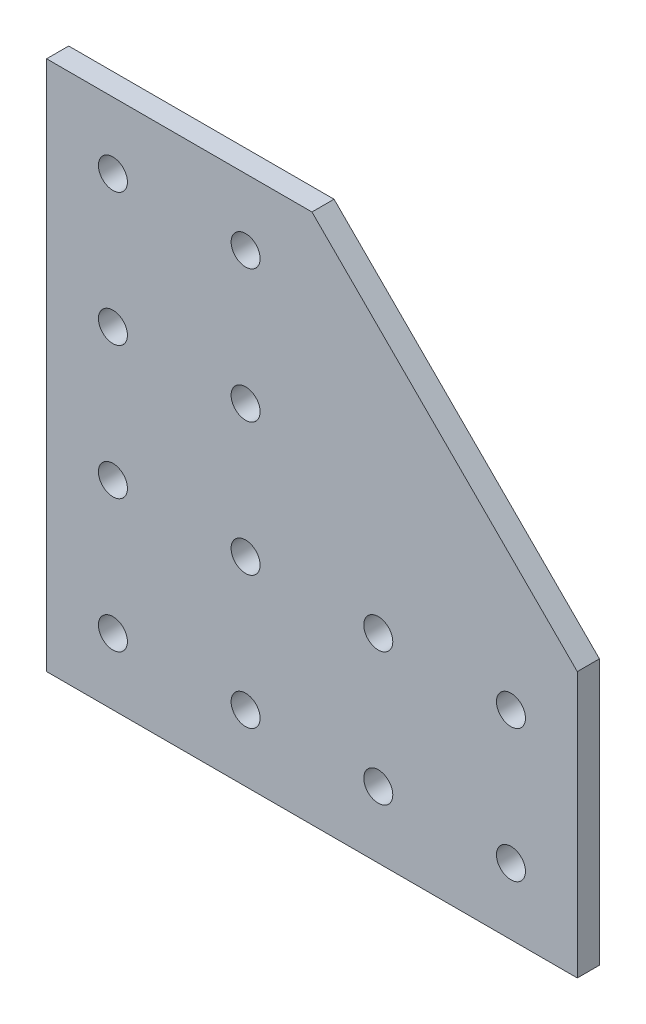
ISO-10303-21;
HEADER;
FILE_DESCRIPTION(('STEP AP214'),'2;1');
FILE_NAME('part.step','',(''),(''),'','','');
FILE_SCHEMA(('AUTOMOTIVE_DESIGN { 1 0 10303 214 1 1 1 1 }'));
ENDSEC;
DATA;
#1=APPLICATION_CONTEXT('core data for automotive mechanical design processes');
#2=APPLICATION_PROTOCOL_DEFINITION('international standard','automotive_design',2000,#1);
#3=PRODUCT_CONTEXT('',#1,'mechanical');
#4=PRODUCT('Part','Part','',(#3));
#5=PRODUCT_RELATED_PRODUCT_CATEGORY('part','',(#4));
#6=PRODUCT_DEFINITION_FORMATION('','',#4);
#7=PRODUCT_DEFINITION_CONTEXT('part definition',#1,'design');
#8=PRODUCT_DEFINITION('design','',#6,#7);
#9=PRODUCT_DEFINITION_SHAPE('','',#8);
#10=(LENGTH_UNIT() NAMED_UNIT(*) SI_UNIT(.MILLI.,.METRE.));
#11=(NAMED_UNIT(*) PLANE_ANGLE_UNIT() SI_UNIT($,.RADIAN.));
#12=(NAMED_UNIT(*) SI_UNIT($,.STERADIAN.) SOLID_ANGLE_UNIT());
#13=UNCERTAINTY_MEASURE_WITH_UNIT(LENGTH_MEASURE(1.E-05),#10,'distance_accuracy_value','');
#14=(GEOMETRIC_REPRESENTATION_CONTEXT(3) GLOBAL_UNCERTAINTY_ASSIGNED_CONTEXT((#13)) GLOBAL_UNIT_ASSIGNED_CONTEXT((#10,
#11,#12)) REPRESENTATION_CONTEXT('',''));
#15=CARTESIAN_POINT('',(0.,0.,0.));
#16=DIRECTION('',(0.,0.,1.));
#17=DIRECTION('',(1.,0.,0.));
#18=AXIS2_PLACEMENT_3D('',#15,#16,#17);
#19=CARTESIAN_POINT('',(0.,0.,3.175));
#20=DIRECTION('',(0.,0.,-1.));
#21=DIRECTION('',(-1.,0.,0.));
#22=AXIS2_PLACEMENT_3D('',#19,#20,#21);
#23=PLANE('',#22);
#24=CARTESIAN_POINT('',(57.15,133.35,3.175));
#25=DIRECTION('',(0.,0.,1.));
#26=DIRECTION('',(1.,0.,0.));
#27=AXIS2_PLACEMENT_3D('',#24,#25,#26);
#28=CIRCLE('',#27,4.1656);
#29=CARTESIAN_POINT('',(61.3156,133.35,3.175));
#30=VERTEX_POINT('',#29);
#31=EDGE_CURVE('E208',#30,#30,#28,.T.);
#32=ORIENTED_EDGE('',*,*,#31,.F.);
#33=EDGE_LOOP('',(#32));
#34=FACE_BOUND('',#33,.T.);
#35=CARTESIAN_POINT('',(57.15,57.15,3.175));
#36=DIRECTION('',(0.,0.,1.));
#37=DIRECTION('',(1.,0.,0.));
#38=AXIS2_PLACEMENT_3D('',#35,#36,#37);
#39=CIRCLE('',#38,4.1656);
#40=CARTESIAN_POINT('',(61.3156,57.15,3.175));
#41=VERTEX_POINT('',#40);
#42=EDGE_CURVE('E220',#41,#41,#39,.T.);
#43=ORIENTED_EDGE('',*,*,#42,.F.);
#44=EDGE_LOOP('',(#43));
#45=FACE_BOUND('',#44,.T.);
#46=CARTESIAN_POINT('',(133.35,57.15,3.175));
#47=DIRECTION('',(0.,0.,1.));
#48=DIRECTION('',(1.,0.,0.));
#49=AXIS2_PLACEMENT_3D('',#46,#47,#48);
#50=CIRCLE('',#49,4.1656);
#51=CARTESIAN_POINT('',(137.5156,57.15,3.175));
#52=VERTEX_POINT('',#51);
#53=EDGE_CURVE('E232',#52,#52,#50,.T.);
#54=ORIENTED_EDGE('',*,*,#53,.F.);
#55=EDGE_LOOP('',(#54));
#56=FACE_BOUND('',#55,.T.);
#57=CARTESIAN_POINT('',(19.05,95.25,3.175));
#58=DIRECTION('',(0.,0.,1.));
#59=DIRECTION('',(1.,0.,0.));
#60=AXIS2_PLACEMENT_3D('',#57,#58,#59);
#61=CIRCLE('',#60,4.1656);
#62=CARTESIAN_POINT('',(23.2156,95.25,3.175));
#63=VERTEX_POINT('',#62);
#64=EDGE_CURVE('E244',#63,#63,#61,.T.);
#65=ORIENTED_EDGE('',*,*,#64,.F.);
#66=EDGE_LOOP('',(#65));
#67=FACE_BOUND('',#66,.T.);
#68=CARTESIAN_POINT('',(57.15,19.05,3.175));
#69=DIRECTION('',(0.,0.,1.));
#70=DIRECTION('',(1.,0.,0.));
#71=AXIS2_PLACEMENT_3D('',#68,#69,#70);
#72=CIRCLE('',#71,4.1656);
#73=CARTESIAN_POINT('',(61.3156,19.05,3.175));
#74=VERTEX_POINT('',#73);
#75=EDGE_CURVE('E256',#74,#74,#72,.T.);
#76=ORIENTED_EDGE('',*,*,#75,.F.);
#77=EDGE_LOOP('',(#76));
#78=FACE_BOUND('',#77,.T.);
#79=CARTESIAN_POINT('',(133.35,19.05,3.175));
#80=DIRECTION('',(0.,0.,1.));
#81=DIRECTION('',(1.,0.,0.));
#82=AXIS2_PLACEMENT_3D('',#79,#80,#81);
#83=CIRCLE('',#82,4.1656);
#84=CARTESIAN_POINT('',(137.5156,19.05,3.175));
#85=VERTEX_POINT('',#84);
#86=EDGE_CURVE('E115',#85,#85,#83,.T.);
#87=ORIENTED_EDGE('',*,*,#86,.F.);
#88=EDGE_LOOP('',(#87));
#89=FACE_BOUND('',#88,.T.);
#90=DIRECTION('',(1.,0.,0.));
#91=VECTOR('',#90,1.);
#92=CARTESIAN_POINT('',(152.4,0.,3.175));
#93=LINE('',#92,#91);
#94=CARTESIAN_POINT('',(0.,0.,3.175));
#95=VERTEX_POINT('',#94);
#96=CARTESIAN_POINT('',(152.4,0.,3.175));
#97=VERTEX_POINT('',#96);
#98=EDGE_CURVE('E120',#95,#97,#93,.T.);
#99=ORIENTED_EDGE('',*,*,#98,.T.);
#100=DIRECTION('',(0.,1.,0.));
#101=VECTOR('',#100,1.);
#102=CARTESIAN_POINT('',(152.4,76.2,3.175));
#103=LINE('',#102,#101);
#104=CARTESIAN_POINT('',(152.4,76.2,3.175));
#105=VERTEX_POINT('',#104);
#106=EDGE_CURVE('E87',#97,#105,#103,.T.);
#107=ORIENTED_EDGE('',*,*,#106,.T.);
#108=DIRECTION('',(-0.707106781186547,0.707106781186547,0.));
#109=VECTOR('',#108,1.);
#110=CARTESIAN_POINT('',(152.4,76.2,3.175));
#111=LINE('',#110,#109);
#112=CARTESIAN_POINT('',(76.2,152.4,3.175));
#113=VERTEX_POINT('',#112);
#114=EDGE_CURVE('E91',#105,#113,#111,.T.);
#115=ORIENTED_EDGE('',*,*,#114,.T.);
#116=DIRECTION('',(-1.,0.,0.));
#117=VECTOR('',#116,1.);
#118=CARTESIAN_POINT('',(0.,152.4,3.175));
#119=LINE('',#118,#117);
#120=CARTESIAN_POINT('',(0.,152.4,3.175));
#121=VERTEX_POINT('',#120);
#122=EDGE_CURVE('E95',#113,#121,#119,.T.);
#123=ORIENTED_EDGE('',*,*,#122,.T.);
#124=DIRECTION('',(0.,-1.,0.));
#125=VECTOR('',#124,1.);
#126=CARTESIAN_POINT('',(0.,0.,3.175));
#127=LINE('',#126,#125);
#128=EDGE_CURVE('E53',#121,#95,#127,.T.);
#129=ORIENTED_EDGE('',*,*,#128,.T.);
#130=EDGE_LOOP('',(#99,#107,#115,#123,#129));
#131=FACE_BOUND('',#130,.T.);
#132=CARTESIAN_POINT('',(19.05,19.05,3.175));
#133=DIRECTION('',(0.,0.,1.));
#134=DIRECTION('',(1.,0.,0.));
#135=AXIS2_PLACEMENT_3D('',#132,#133,#134);
#136=CIRCLE('',#135,4.1656);
#137=CARTESIAN_POINT('',(23.2156,19.05,3.175));
#138=VERTEX_POINT('',#137);
#139=EDGE_CURVE('E262',#138,#138,#136,.T.);
#140=ORIENTED_EDGE('',*,*,#139,.F.);
#141=EDGE_LOOP('',(#140));
#142=FACE_BOUND('',#141,.T.);
#143=CARTESIAN_POINT('',(95.25,19.05,3.175));
#144=DIRECTION('',(0.,0.,1.));
#145=DIRECTION('',(1.,0.,0.));
#146=AXIS2_PLACEMENT_3D('',#143,#144,#145);
#147=CIRCLE('',#146,4.1656);
#148=CARTESIAN_POINT('',(99.4156,19.05,3.175));
#149=VERTEX_POINT('',#148);
#150=EDGE_CURVE('E250',#149,#149,#147,.T.);
#151=ORIENTED_EDGE('',*,*,#150,.F.);
#152=EDGE_LOOP('',(#151));
#153=FACE_BOUND('',#152,.T.);
#154=CARTESIAN_POINT('',(19.05,57.15,3.175));
#155=DIRECTION('',(0.,0.,1.));
#156=DIRECTION('',(1.,0.,0.));
#157=AXIS2_PLACEMENT_3D('',#154,#155,#156);
#158=CIRCLE('',#157,4.1656);
#159=CARTESIAN_POINT('',(23.2156,57.15,3.175));
#160=VERTEX_POINT('',#159);
#161=EDGE_CURVE('E238',#160,#160,#158,.T.);
#162=ORIENTED_EDGE('',*,*,#161,.F.);
#163=EDGE_LOOP('',(#162));
#164=FACE_BOUND('',#163,.T.);
#165=CARTESIAN_POINT('',(95.25,57.15,3.175));
#166=DIRECTION('',(0.,0.,1.));
#167=DIRECTION('',(1.,0.,0.));
#168=AXIS2_PLACEMENT_3D('',#165,#166,#167);
#169=CIRCLE('',#168,4.1656);
#170=CARTESIAN_POINT('',(99.4156,57.15,3.175));
#171=VERTEX_POINT('',#170);
#172=EDGE_CURVE('E226',#171,#171,#169,.T.);
#173=ORIENTED_EDGE('',*,*,#172,.F.);
#174=EDGE_LOOP('',(#173));
#175=FACE_BOUND('',#174,.T.);
#176=CARTESIAN_POINT('',(19.05,133.35,3.175));
#177=DIRECTION('',(0.,0.,1.));
#178=DIRECTION('',(1.,0.,0.));
#179=AXIS2_PLACEMENT_3D('',#176,#177,#178);
#180=CIRCLE('',#179,4.1656);
#181=CARTESIAN_POINT('',(23.2156,133.35,3.175));
#182=VERTEX_POINT('',#181);
#183=EDGE_CURVE('E214',#182,#182,#180,.T.);
#184=ORIENTED_EDGE('',*,*,#183,.F.);
#185=EDGE_LOOP('',(#184));
#186=FACE_BOUND('',#185,.T.);
#187=CARTESIAN_POINT('',(57.15,95.25,3.175));
#188=DIRECTION('',(0.,0.,1.));
#189=DIRECTION('',(1.,0.,0.));
#190=AXIS2_PLACEMENT_3D('',#187,#188,#189);
#191=CIRCLE('',#190,4.1656);
#192=CARTESIAN_POINT('',(61.3156,95.25,3.175));
#193=VERTEX_POINT('',#192);
#194=EDGE_CURVE('E199',#193,#193,#191,.T.);
#195=ORIENTED_EDGE('',*,*,#194,.F.);
#196=EDGE_LOOP('',(#195));
#197=FACE_BOUND('',#196,.T.);
#198=ADVANCED_FACE('F36',(#34,#45,#56,#67,#78,#89,#131,#142,#153,#164,#175,#186,#197),#23,.F.);
#199=CARTESIAN_POINT('',(0.,0.,-3.175));
#200=DIRECTION('',(0.,0.,-1.));
#201=DIRECTION('',(-1.,0.,0.));
#202=AXIS2_PLACEMENT_3D('',#199,#200,#201);
#203=PLANE('',#202);
#204=CARTESIAN_POINT('',(57.15,133.35,-3.175));
#205=DIRECTION('',(0.,0.,1.));
#206=DIRECTION('',(1.,0.,0.));
#207=AXIS2_PLACEMENT_3D('',#204,#205,#206);
#208=CIRCLE('',#207,4.1656);
#209=CARTESIAN_POINT('',(61.3156,133.35,-3.175));
#210=VERTEX_POINT('',#209);
#211=EDGE_CURVE('E205',#210,#210,#208,.T.);
#212=ORIENTED_EDGE('',*,*,#211,.T.);
#213=EDGE_LOOP('',(#212));
#214=FACE_BOUND('',#213,.T.);
#215=CARTESIAN_POINT('',(57.15,57.15,-3.175));
#216=DIRECTION('',(0.,0.,1.));
#217=DIRECTION('',(1.,0.,0.));
#218=AXIS2_PLACEMENT_3D('',#215,#216,#217);
#219=CIRCLE('',#218,4.1656);
#220=CARTESIAN_POINT('',(61.3156,57.15,-3.175));
#221=VERTEX_POINT('',#220);
#222=EDGE_CURVE('E217',#221,#221,#219,.T.);
#223=ORIENTED_EDGE('',*,*,#222,.T.);
#224=EDGE_LOOP('',(#223));
#225=FACE_BOUND('',#224,.T.);
#226=CARTESIAN_POINT('',(133.35,57.15,-3.175));
#227=DIRECTION('',(0.,0.,1.));
#228=DIRECTION('',(1.,0.,0.));
#229=AXIS2_PLACEMENT_3D('',#226,#227,#228);
#230=CIRCLE('',#229,4.1656);
#231=CARTESIAN_POINT('',(137.5156,57.15,-3.175));
#232=VERTEX_POINT('',#231);
#233=EDGE_CURVE('E229',#232,#232,#230,.T.);
#234=ORIENTED_EDGE('',*,*,#233,.T.);
#235=EDGE_LOOP('',(#234));
#236=FACE_BOUND('',#235,.T.);
#237=CARTESIAN_POINT('',(19.05,95.25,-3.175));
#238=DIRECTION('',(0.,0.,1.));
#239=DIRECTION('',(1.,0.,0.));
#240=AXIS2_PLACEMENT_3D('',#237,#238,#239);
#241=CIRCLE('',#240,4.1656);
#242=CARTESIAN_POINT('',(23.2156,95.25,-3.175));
#243=VERTEX_POINT('',#242);
#244=EDGE_CURVE('E241',#243,#243,#241,.T.);
#245=ORIENTED_EDGE('',*,*,#244,.T.);
#246=EDGE_LOOP('',(#245));
#247=FACE_BOUND('',#246,.T.);
#248=CARTESIAN_POINT('',(57.15,19.05,-3.175));
#249=DIRECTION('',(0.,0.,1.));
#250=DIRECTION('',(1.,0.,0.));
#251=AXIS2_PLACEMENT_3D('',#248,#249,#250);
#252=CIRCLE('',#251,4.1656);
#253=CARTESIAN_POINT('',(61.3156,19.05,-3.175));
#254=VERTEX_POINT('',#253);
#255=EDGE_CURVE('E253',#254,#254,#252,.T.);
#256=ORIENTED_EDGE('',*,*,#255,.T.);
#257=EDGE_LOOP('',(#256));
#258=FACE_BOUND('',#257,.T.);
#259=CARTESIAN_POINT('',(133.35,19.05,-3.175));
#260=DIRECTION('',(0.,0.,1.));
#261=DIRECTION('',(1.,0.,0.));
#262=AXIS2_PLACEMENT_3D('',#259,#260,#261);
#263=CIRCLE('',#262,4.1656);
#264=CARTESIAN_POINT('',(137.5156,19.05,-3.175));
#265=VERTEX_POINT('',#264);
#266=EDGE_CURVE('E265',#265,#265,#263,.T.);
#267=ORIENTED_EDGE('',*,*,#266,.T.);
#268=EDGE_LOOP('',(#267));
#269=FACE_BOUND('',#268,.T.);
#270=DIRECTION('',(1.,0.,0.));
#271=VECTOR('',#270,1.);
#272=CARTESIAN_POINT('',(152.4,0.,-3.175));
#273=LINE('',#272,#271);
#274=CARTESIAN_POINT('',(0.,0.,-3.175));
#275=VERTEX_POINT('',#274);
#276=CARTESIAN_POINT('',(152.4,0.,-3.175));
#277=VERTEX_POINT('',#276);
#278=EDGE_CURVE('E111',#275,#277,#273,.T.);
#279=ORIENTED_EDGE('',*,*,#278,.F.);
#280=DIRECTION('',(0.,-1.,0.));
#281=VECTOR('',#280,1.);
#282=CARTESIAN_POINT('',(0.,0.,-3.175));
#283=LINE('',#282,#281);
#284=CARTESIAN_POINT('',(0.,152.4,-3.175));
#285=VERTEX_POINT('',#284);
#286=EDGE_CURVE('E79',#285,#275,#283,.T.);
#287=ORIENTED_EDGE('',*,*,#286,.F.);
#288=DIRECTION('',(-1.,0.,0.));
#289=VECTOR('',#288,1.);
#290=CARTESIAN_POINT('',(0.,152.4,-3.175));
#291=LINE('',#290,#289);
#292=CARTESIAN_POINT('',(76.2,152.4,-3.175));
#293=VERTEX_POINT('',#292);
#294=EDGE_CURVE('E73',#293,#285,#291,.T.);
#295=ORIENTED_EDGE('',*,*,#294,.F.);
#296=DIRECTION('',(-0.707106781186547,0.707106781186547,0.));
#297=VECTOR('',#296,1.);
#298=CARTESIAN_POINT('',(152.4,76.2,-3.175));
#299=LINE('',#298,#297);
#300=CARTESIAN_POINT('',(152.4,76.2,-3.175));
#301=VERTEX_POINT('',#300);
#302=EDGE_CURVE('E102',#301,#293,#299,.T.);
#303=ORIENTED_EDGE('',*,*,#302,.F.);
#304=DIRECTION('',(0.,1.,0.));
#305=VECTOR('',#304,1.);
#306=CARTESIAN_POINT('',(152.4,76.2,-3.175));
#307=LINE('',#306,#305);
#308=EDGE_CURVE('E114',#277,#301,#307,.T.);
#309=ORIENTED_EDGE('',*,*,#308,.F.);
#310=EDGE_LOOP('',(#279,#287,#295,#303,#309));
#311=FACE_BOUND('',#310,.T.);
#312=CARTESIAN_POINT('',(19.05,19.05,-3.175));
#313=DIRECTION('',(0.,0.,1.));
#314=DIRECTION('',(1.,0.,0.));
#315=AXIS2_PLACEMENT_3D('',#312,#313,#314);
#316=CIRCLE('',#315,4.1656);
#317=CARTESIAN_POINT('',(23.2156,19.05,-3.175));
#318=VERTEX_POINT('',#317);
#319=EDGE_CURVE('E259',#318,#318,#316,.T.);
#320=ORIENTED_EDGE('',*,*,#319,.T.);
#321=EDGE_LOOP('',(#320));
#322=FACE_BOUND('',#321,.T.);
#323=CARTESIAN_POINT('',(95.25,19.05,-3.175));
#324=DIRECTION('',(0.,0.,1.));
#325=DIRECTION('',(1.,0.,0.));
#326=AXIS2_PLACEMENT_3D('',#323,#324,#325);
#327=CIRCLE('',#326,4.1656);
#328=CARTESIAN_POINT('',(99.4156,19.05,-3.175));
#329=VERTEX_POINT('',#328);
#330=EDGE_CURVE('E247',#329,#329,#327,.T.);
#331=ORIENTED_EDGE('',*,*,#330,.T.);
#332=EDGE_LOOP('',(#331));
#333=FACE_BOUND('',#332,.T.);
#334=CARTESIAN_POINT('',(19.05,57.15,-3.175));
#335=DIRECTION('',(0.,0.,1.));
#336=DIRECTION('',(1.,0.,0.));
#337=AXIS2_PLACEMENT_3D('',#334,#335,#336);
#338=CIRCLE('',#337,4.1656);
#339=CARTESIAN_POINT('',(23.2156,57.15,-3.175));
#340=VERTEX_POINT('',#339);
#341=EDGE_CURVE('E235',#340,#340,#338,.T.);
#342=ORIENTED_EDGE('',*,*,#341,.T.);
#343=EDGE_LOOP('',(#342));
#344=FACE_BOUND('',#343,.T.);
#345=CARTESIAN_POINT('',(95.25,57.15,-3.175));
#346=DIRECTION('',(0.,0.,1.));
#347=DIRECTION('',(1.,0.,0.));
#348=AXIS2_PLACEMENT_3D('',#345,#346,#347);
#349=CIRCLE('',#348,4.1656);
#350=CARTESIAN_POINT('',(99.4156,57.15,-3.175));
#351=VERTEX_POINT('',#350);
#352=EDGE_CURVE('E223',#351,#351,#349,.T.);
#353=ORIENTED_EDGE('',*,*,#352,.T.);
#354=EDGE_LOOP('',(#353));
#355=FACE_BOUND('',#354,.T.);
#356=CARTESIAN_POINT('',(19.05,133.35,-3.175));
#357=DIRECTION('',(0.,0.,1.));
#358=DIRECTION('',(1.,0.,0.));
#359=AXIS2_PLACEMENT_3D('',#356,#357,#358);
#360=CIRCLE('',#359,4.1656);
#361=CARTESIAN_POINT('',(23.2156,133.35,-3.175));
#362=VERTEX_POINT('',#361);
#363=EDGE_CURVE('E211',#362,#362,#360,.T.);
#364=ORIENTED_EDGE('',*,*,#363,.T.);
#365=EDGE_LOOP('',(#364));
#366=FACE_BOUND('',#365,.T.);
#367=CARTESIAN_POINT('',(57.15,95.25,-3.175));
#368=DIRECTION('',(0.,0.,1.));
#369=DIRECTION('',(1.,0.,0.));
#370=AXIS2_PLACEMENT_3D('',#367,#368,#369);
#371=CIRCLE('',#370,4.1656);
#372=CARTESIAN_POINT('',(61.3156,95.25,-3.175));
#373=VERTEX_POINT('',#372);
#374=EDGE_CURVE('E202',#373,#373,#371,.T.);
#375=ORIENTED_EDGE('',*,*,#374,.T.);
#376=EDGE_LOOP('',(#375));
#377=FACE_BOUND('',#376,.T.);
#378=ADVANCED_FACE('F124',(#214,#225,#236,#247,#258,#269,#311,#322,#333,#344,#355,#366,#377),
#203,.T.);
#379=CARTESIAN_POINT('',(152.4,0.,3.175));
#380=DIRECTION('',(0.,1.,0.));
#381=DIRECTION('',(-1.,0.,0.));
#382=AXIS2_PLACEMENT_3D('',#379,#380,#381);
#383=PLANE('',#382);
#384=ORIENTED_EDGE('',*,*,#278,.T.);
#385=DIRECTION('',(0.,0.,-1.));
#386=VECTOR('',#385,1.);
#387=CARTESIAN_POINT('',(152.4,0.,3.175));
#388=LINE('',#387,#386);
#389=EDGE_CURVE('E11',#97,#277,#388,.T.);
#390=ORIENTED_EDGE('',*,*,#389,.F.);
#391=ORIENTED_EDGE('',*,*,#98,.F.);
#392=DIRECTION('',(0.,0.,-1.));
#393=VECTOR('',#392,1.);
#394=CARTESIAN_POINT('',(0.,0.,3.175));
#395=LINE('',#394,#393);
#396=EDGE_CURVE('E107',#95,#275,#395,.T.);
#397=ORIENTED_EDGE('',*,*,#396,.T.);
#398=EDGE_LOOP('',(#384,#390,#391,#397));
#399=FACE_BOUND('',#398,.T.);
#400=ADVANCED_FACE('F38',(#399),#383,.F.);
#401=CARTESIAN_POINT('',(152.4,76.2,3.175));
#402=DIRECTION('',(-1.,0.,0.));
#403=DIRECTION('',(0.,0.,1.));
#404=AXIS2_PLACEMENT_3D('',#401,#402,#403);
#405=PLANE('',#404);
#406=ORIENTED_EDGE('',*,*,#308,.T.);
#407=DIRECTION('',(0.,0.,-1.));
#408=VECTOR('',#407,1.);
#409=CARTESIAN_POINT('',(152.4,76.2,3.175));
#410=LINE('',#409,#408);
#411=EDGE_CURVE('E45',#105,#301,#410,.T.);
#412=ORIENTED_EDGE('',*,*,#411,.F.);
#413=ORIENTED_EDGE('',*,*,#106,.F.);
#414=ORIENTED_EDGE('',*,*,#389,.T.);
#415=EDGE_LOOP('',(#406,#412,#413,#414));
#416=FACE_BOUND('',#415,.T.);
#417=ADVANCED_FACE('F385',(#416),#405,.F.);
#418=CARTESIAN_POINT('',(152.4,76.2,3.175));
#419=DIRECTION('',(-0.707106781186548,-0.707106781186548,0.));
#420=DIRECTION('',(0.707106781186548,-0.707106781186548,0.));
#421=AXIS2_PLACEMENT_3D('',#418,#419,#420);
#422=PLANE('',#421);
#423=ORIENTED_EDGE('',*,*,#302,.T.);
#424=DIRECTION('',(0.,0.,-1.));
#425=VECTOR('',#424,1.);
#426=CARTESIAN_POINT('',(76.2,152.4,3.175));
#427=LINE('',#426,#425);
#428=EDGE_CURVE('E99',#113,#293,#427,.T.);
#429=ORIENTED_EDGE('',*,*,#428,.F.);
#430=ORIENTED_EDGE('',*,*,#114,.F.);
#431=ORIENTED_EDGE('',*,*,#411,.T.);
#432=EDGE_LOOP('',(#423,#429,#430,#431));
#433=FACE_BOUND('',#432,.T.);
#434=ADVANCED_FACE('F100',(#433),#422,.F.);
#435=CARTESIAN_POINT('',(0.,152.4,3.175));
#436=DIRECTION('',(0.,-1.,0.));
#437=DIRECTION('',(0.,0.,-1.));
#438=AXIS2_PLACEMENT_3D('',#435,#436,#437);
#439=PLANE('',#438);
#440=ORIENTED_EDGE('',*,*,#294,.T.);
#441=DIRECTION('',(0.,0.,-1.));
#442=VECTOR('',#441,1.);
#443=CARTESIAN_POINT('',(0.,152.4,3.175));
#444=LINE('',#443,#442);
#445=EDGE_CURVE('E103',#121,#285,#444,.T.);
#446=ORIENTED_EDGE('',*,*,#445,.F.);
#447=ORIENTED_EDGE('',*,*,#122,.F.);
#448=ORIENTED_EDGE('',*,*,#428,.T.);
#449=EDGE_LOOP('',(#440,#446,#447,#448));
#450=FACE_BOUND('',#449,.T.);
#451=ADVANCED_FACE('F105',(#450),#439,.F.);
#452=CARTESIAN_POINT('',(0.,0.,3.175));
#453=DIRECTION('',(1.,0.,0.));
#454=DIRECTION('',(0.,0.,-1.));
#455=AXIS2_PLACEMENT_3D('',#452,#453,#454);
#456=PLANE('',#455);
#457=ORIENTED_EDGE('',*,*,#286,.T.);
#458=ORIENTED_EDGE('',*,*,#396,.F.);
#459=ORIENTED_EDGE('',*,*,#128,.F.);
#460=ORIENTED_EDGE('',*,*,#445,.T.);
#461=EDGE_LOOP('',(#457,#458,#459,#460));
#462=FACE_BOUND('',#461,.T.);
#463=ADVANCED_FACE('F129',(#462),#456,.F.);
#464=CARTESIAN_POINT('',(133.35,19.05,3.175));
#465=DIRECTION('',(0.,0.,-1.));
#466=DIRECTION('',(-1.,0.,0.));
#467=AXIS2_PLACEMENT_3D('',#464,#465,#466);
#468=CYLINDRICAL_SURFACE('',#467,4.1656);
#469=ORIENTED_EDGE('',*,*,#86,.T.);
#470=EDGE_LOOP('',(#469));
#471=FACE_BOUND('',#470,.T.);
#472=ORIENTED_EDGE('',*,*,#266,.F.);
#473=EDGE_LOOP('',(#472));
#474=FACE_BOUND('',#473,.T.);
#475=ADVANCED_FACE('F131',(#471,#474),#468,.F.);
#476=CARTESIAN_POINT('',(19.05,19.05,3.175));
#477=DIRECTION('',(0.,0.,-1.));
#478=DIRECTION('',(-1.,0.,0.));
#479=AXIS2_PLACEMENT_3D('',#476,#477,#478);
#480=CYLINDRICAL_SURFACE('',#479,4.1656);
#481=ORIENTED_EDGE('',*,*,#139,.T.);
#482=EDGE_LOOP('',(#481));
#483=FACE_BOUND('',#482,.T.);
#484=ORIENTED_EDGE('',*,*,#319,.F.);
#485=EDGE_LOOP('',(#484));
#486=FACE_BOUND('',#485,.T.);
#487=ADVANCED_FACE('F137',(#483,#486),#480,.F.);
#488=CARTESIAN_POINT('',(57.15,19.05,3.175));
#489=DIRECTION('',(0.,0.,-1.));
#490=DIRECTION('',(-1.,0.,0.));
#491=AXIS2_PLACEMENT_3D('',#488,#489,#490);
#492=CYLINDRICAL_SURFACE('',#491,4.1656);
#493=ORIENTED_EDGE('',*,*,#75,.T.);
#494=EDGE_LOOP('',(#493));
#495=FACE_BOUND('',#494,.T.);
#496=ORIENTED_EDGE('',*,*,#255,.F.);
#497=EDGE_LOOP('',(#496));
#498=FACE_BOUND('',#497,.T.);
#499=ADVANCED_FACE('F154',(#495,#498),#492,.F.);
#500=CARTESIAN_POINT('',(95.25,19.05,3.175));
#501=DIRECTION('',(0.,0.,-1.));
#502=DIRECTION('',(-1.,0.,0.));
#503=AXIS2_PLACEMENT_3D('',#500,#501,#502);
#504=CYLINDRICAL_SURFACE('',#503,4.1656);
#505=ORIENTED_EDGE('',*,*,#150,.T.);
#506=EDGE_LOOP('',(#505));
#507=FACE_BOUND('',#506,.T.);
#508=ORIENTED_EDGE('',*,*,#330,.F.);
#509=EDGE_LOOP('',(#508));
#510=FACE_BOUND('',#509,.T.);
#511=ADVANCED_FACE('F158',(#507,#510),#504,.F.);
#512=CARTESIAN_POINT('',(19.05,95.25,3.175));
#513=DIRECTION('',(0.,0.,-1.));
#514=DIRECTION('',(-1.,0.,0.));
#515=AXIS2_PLACEMENT_3D('',#512,#513,#514);
#516=CYLINDRICAL_SURFACE('',#515,4.1656);
#517=ORIENTED_EDGE('',*,*,#64,.T.);
#518=EDGE_LOOP('',(#517));
#519=FACE_BOUND('',#518,.T.);
#520=ORIENTED_EDGE('',*,*,#244,.F.);
#521=EDGE_LOOP('',(#520));
#522=FACE_BOUND('',#521,.T.);
#523=ADVANCED_FACE('F162',(#519,#522),#516,.F.);
#524=CARTESIAN_POINT('',(19.05,57.15,3.175));
#525=DIRECTION('',(0.,0.,-1.));
#526=DIRECTION('',(-1.,0.,0.));
#527=AXIS2_PLACEMENT_3D('',#524,#525,#526);
#528=CYLINDRICAL_SURFACE('',#527,4.1656);
#529=ORIENTED_EDGE('',*,*,#161,.T.);
#530=EDGE_LOOP('',(#529));
#531=FACE_BOUND('',#530,.T.);
#532=ORIENTED_EDGE('',*,*,#341,.F.);
#533=EDGE_LOOP('',(#532));
#534=FACE_BOUND('',#533,.T.);
#535=ADVANCED_FACE('F166',(#531,#534),#528,.F.);
#536=CARTESIAN_POINT('',(133.35,57.15,3.175));
#537=DIRECTION('',(0.,0.,-1.));
#538=DIRECTION('',(-1.,0.,0.));
#539=AXIS2_PLACEMENT_3D('',#536,#537,#538);
#540=CYLINDRICAL_SURFACE('',#539,4.1656);
#541=ORIENTED_EDGE('',*,*,#53,.T.);
#542=EDGE_LOOP('',(#541));
#543=FACE_BOUND('',#542,.T.);
#544=ORIENTED_EDGE('',*,*,#233,.F.);
#545=EDGE_LOOP('',(#544));
#546=FACE_BOUND('',#545,.T.);
#547=ADVANCED_FACE('F170',(#543,#546),#540,.F.);
#548=CARTESIAN_POINT('',(95.25,57.15,3.175));
#549=DIRECTION('',(0.,0.,-1.));
#550=DIRECTION('',(-1.,0.,0.));
#551=AXIS2_PLACEMENT_3D('',#548,#549,#550);
#552=CYLINDRICAL_SURFACE('',#551,4.1656);
#553=ORIENTED_EDGE('',*,*,#172,.T.);
#554=EDGE_LOOP('',(#553));
#555=FACE_BOUND('',#554,.T.);
#556=ORIENTED_EDGE('',*,*,#352,.F.);
#557=EDGE_LOOP('',(#556));
#558=FACE_BOUND('',#557,.T.);
#559=ADVANCED_FACE('F174',(#555,#558),#552,.F.);
#560=CARTESIAN_POINT('',(57.15,57.15,3.175));
#561=DIRECTION('',(0.,0.,-1.));
#562=DIRECTION('',(-1.,0.,0.));
#563=AXIS2_PLACEMENT_3D('',#560,#561,#562);
#564=CYLINDRICAL_SURFACE('',#563,4.1656);
#565=ORIENTED_EDGE('',*,*,#42,.T.);
#566=EDGE_LOOP('',(#565));
#567=FACE_BOUND('',#566,.T.);
#568=ORIENTED_EDGE('',*,*,#222,.F.);
#569=EDGE_LOOP('',(#568));
#570=FACE_BOUND('',#569,.T.);
#571=ADVANCED_FACE('F178',(#567,#570),#564,.F.);
#572=CARTESIAN_POINT('',(19.05,133.35,3.175));
#573=DIRECTION('',(0.,0.,-1.));
#574=DIRECTION('',(-1.,0.,0.));
#575=AXIS2_PLACEMENT_3D('',#572,#573,#574);
#576=CYLINDRICAL_SURFACE('',#575,4.1656);
#577=ORIENTED_EDGE('',*,*,#183,.T.);
#578=EDGE_LOOP('',(#577));
#579=FACE_BOUND('',#578,.T.);
#580=ORIENTED_EDGE('',*,*,#363,.F.);
#581=EDGE_LOOP('',(#580));
#582=FACE_BOUND('',#581,.T.);
#583=ADVANCED_FACE('F182',(#579,#582),#576,.F.);
#584=CARTESIAN_POINT('',(57.15,133.35,3.175));
#585=DIRECTION('',(0.,0.,-1.));
#586=DIRECTION('',(-1.,0.,0.));
#587=AXIS2_PLACEMENT_3D('',#584,#585,#586);
#588=CYLINDRICAL_SURFACE('',#587,4.1656);
#589=ORIENTED_EDGE('',*,*,#31,.T.);
#590=EDGE_LOOP('',(#589));
#591=FACE_BOUND('',#590,.T.);
#592=ORIENTED_EDGE('',*,*,#211,.F.);
#593=EDGE_LOOP('',(#592));
#594=FACE_BOUND('',#593,.T.);
#595=ADVANCED_FACE('F186',(#591,#594),#588,.F.);
#596=CARTESIAN_POINT('',(57.15,95.25,3.175));
#597=DIRECTION('',(0.,0.,-1.));
#598=DIRECTION('',(-1.,0.,0.));
#599=AXIS2_PLACEMENT_3D('',#596,#597,#598);
#600=CYLINDRICAL_SURFACE('',#599,4.1656);
#601=ORIENTED_EDGE('',*,*,#194,.T.);
#602=EDGE_LOOP('',(#601));
#603=FACE_BOUND('',#602,.T.);
#604=ORIENTED_EDGE('',*,*,#374,.F.);
#605=EDGE_LOOP('',(#604));
#606=FACE_BOUND('',#605,.T.);
#607=ADVANCED_FACE('F190',(#603,#606),#600,.F.);
#608=CLOSED_SHELL('',(#198,#378,#400,#417,#434,#451,#463,#475,#487,#499,#511,#523,#535,#547,
#559,#571,#583,#595,#607));
#609=MANIFOLD_SOLID_BREP('B2',#608);
#610=ADVANCED_BREP_SHAPE_REPRESENTATION('',(#18,#609),#14);
#611=SHAPE_DEFINITION_REPRESENTATION(#9,#610);
ENDSEC;
END-ISO-10303-21;
